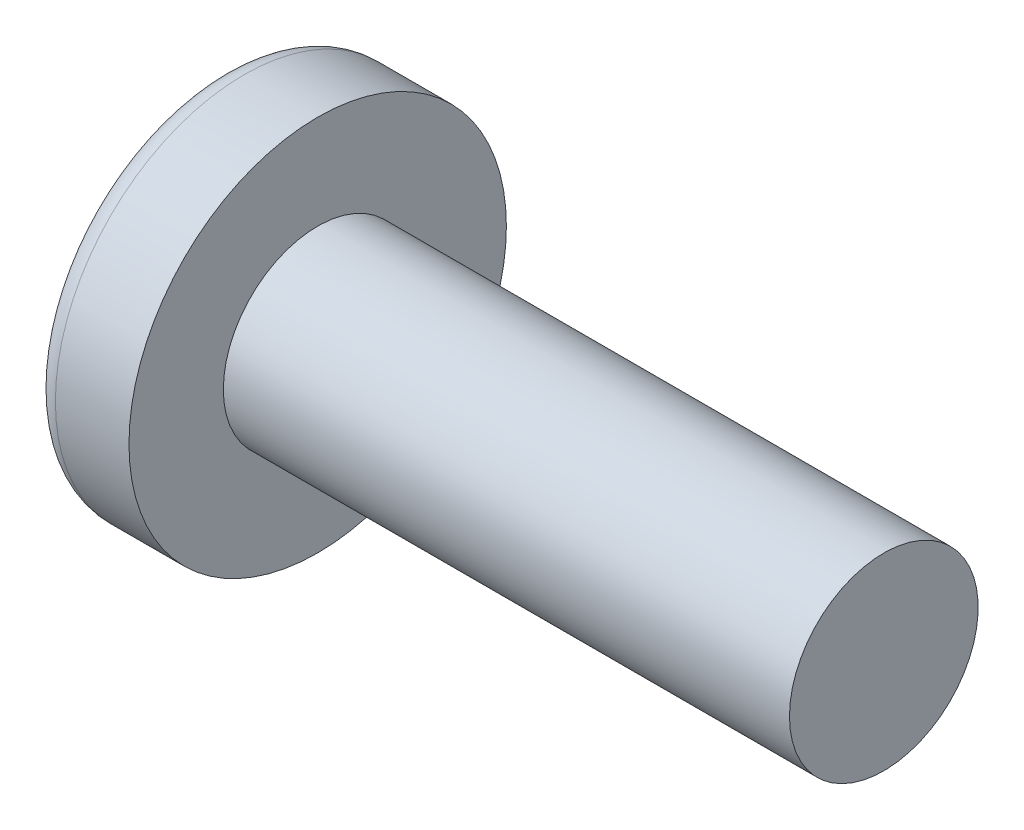
ISO-10303-21;
HEADER;
FILE_DESCRIPTION(('STEP AP214'),'2;1');
FILE_NAME('part.step','',(''),(''),'','','');
FILE_SCHEMA(('AUTOMOTIVE_DESIGN { 1 0 10303 214 1 1 1 1 }'));
ENDSEC;
DATA;
#1=APPLICATION_CONTEXT('core data for automotive mechanical design processes');
#2=APPLICATION_PROTOCOL_DEFINITION('international standard','automotive_design',2000,#1);
#3=PRODUCT_CONTEXT('',#1,'mechanical');
#4=PRODUCT('Part','Part','',(#3));
#5=PRODUCT_RELATED_PRODUCT_CATEGORY('part','',(#4));
#6=PRODUCT_DEFINITION_FORMATION('','',#4);
#7=PRODUCT_DEFINITION_CONTEXT('part definition',#1,'design');
#8=PRODUCT_DEFINITION('design','',#6,#7);
#9=PRODUCT_DEFINITION_SHAPE('','',#8);
#10=(LENGTH_UNIT() NAMED_UNIT(*) SI_UNIT(.MILLI.,.METRE.));
#11=(NAMED_UNIT(*) PLANE_ANGLE_UNIT() SI_UNIT($,.RADIAN.));
#12=(NAMED_UNIT(*) SI_UNIT($,.STERADIAN.) SOLID_ANGLE_UNIT());
#13=UNCERTAINTY_MEASURE_WITH_UNIT(LENGTH_MEASURE(1.E-05),#10,'distance_accuracy_value','');
#14=(GEOMETRIC_REPRESENTATION_CONTEXT(3) GLOBAL_UNCERTAINTY_ASSIGNED_CONTEXT((#13)) GLOBAL_UNIT_ASSIGNED_CONTEXT((#10,
#11,#12)) REPRESENTATION_CONTEXT('',''));
#15=CARTESIAN_POINT('',(0.,0.,0.));
#16=DIRECTION('',(0.,0.,1.));
#17=DIRECTION('',(1.,0.,0.));
#18=AXIS2_PLACEMENT_3D('',#15,#16,#17);
#19=CARTESIAN_POINT('',(3.2,0.,0.));
#20=DIRECTION('',(-1.,0.,0.));
#21=DIRECTION('',(0.,1.,0.));
#22=AXIS2_PLACEMENT_3D('',#19,#20,#21);
#23=SPHERICAL_SURFACE('',#22,3.2);
#24=CARTESIAN_POINT('',(0.627117875780583,0.,0.));
#25=DIRECTION('',(-1.,0.,0.));
#26=DIRECTION('',(0.,0.,1.));
#27=AXIS2_PLACEMENT_3D('',#24,#25,#26);
#28=CIRCLE('',#27,1.9027027027027);
#29=CARTESIAN_POINT('',(0.627117875780583,0.,1.9027027027027));
#30=VERTEX_POINT('',#29);
#31=EDGE_CURVE('E148',#30,#30,#28,.T.);
#32=ORIENTED_EDGE('',*,*,#31,.T.);
#33=EDGE_LOOP('',(#32));
#34=FACE_BOUND('',#33,.T.);
#35=CARTESIAN_POINT('',(3.19174554351625,-0.0818566934638238,0.));
#36=DIRECTION('',(-0.100331502261418,-0.994954064092392,0.));
#37=DIRECTION('',(0.994954064092392,-0.100331502261418,0.));
#38=AXIS2_PLACEMENT_3D('',#35,#36,#37);
#39=CIRCLE('',#38,3.1989422229361);
#40=CARTESIAN_POINT('',(0.118330716626357,0.228067490760365,0.83144431417242));
#41=VERTEX_POINT('',#40);
#42=CARTESIAN_POINT('',(0.0177814447975956,0.238206913129653,0.238206913129654));
#43=VERTEX_POINT('',#42);
#44=EDGE_CURVE('E206',#41,#43,#39,.T.);
#45=ORIENTED_EDGE('',*,*,#44,.F.);
#46=CARTESIAN_POINT('',(2.64043280070581,0.,-0.842892363493775));
#47=DIRECTION('',(0.553083521918191,0.,0.833125811497021));
#48=DIRECTION('',(0.833125811497021,0.,-0.553083521918191));
#49=AXIS2_PLACEMENT_3D('',#46,#47,#48);
#50=CIRCLE('',#49,3.03585523585001);
#51=CARTESIAN_POINT('',(0.118330716626356,-0.22806749076037,0.831444314172418));
#52=VERTEX_POINT('',#51);
#53=EDGE_CURVE('E143',#41,#52,#50,.T.);
#54=ORIENTED_EDGE('',*,*,#53,.T.);
#55=CARTESIAN_POINT('',(3.19174554351625,0.0818566934638236,0.));
#56=DIRECTION('',(-0.100331502261418,0.994954064092392,0.));
#57=DIRECTION('',(-0.994954064092392,-0.100331502261418,0.));
#58=AXIS2_PLACEMENT_3D('',#55,#56,#57);
#59=CIRCLE('',#58,3.1989422229361);
#60=CARTESIAN_POINT('',(0.0177814447975947,-0.238206913129655,0.238206913129654));
#61=VERTEX_POINT('',#60);
#62=EDGE_CURVE('E90',#61,#52,#59,.T.);
#63=ORIENTED_EDGE('',*,*,#62,.F.);
#64=CARTESIAN_POINT('',(3.19174554351625,0.,-0.0818566934638236));
#65=DIRECTION('',(-0.100331502261418,0.,-0.994954064092392));
#66=DIRECTION('',(-0.994954064092392,0.,0.100331502261418));
#67=AXIS2_PLACEMENT_3D('',#64,#65,#66);
#68=CIRCLE('',#67,3.1989422229361);
#69=CARTESIAN_POINT('',(0.118330716626357,-0.831444314172419,0.228067490760367));
#70=VERTEX_POINT('',#69);
#71=EDGE_CURVE('E117',#70,#61,#68,.T.);
#72=ORIENTED_EDGE('',*,*,#71,.F.);
#73=CARTESIAN_POINT('',(2.64043280070581,0.842892363493775,0.));
#74=DIRECTION('',(0.553083521918191,-0.833125811497021,0.));
#75=DIRECTION('',(0.833125811497021,0.553083521918191,0.));
#76=AXIS2_PLACEMENT_3D('',#73,#74,#75);
#77=CIRCLE('',#76,3.03585523585001);
#78=CARTESIAN_POINT('',(0.118330716626356,-0.831444314172419,-0.228067490760367));
#79=VERTEX_POINT('',#78);
#80=EDGE_CURVE('E126',#70,#79,#77,.T.);
#81=ORIENTED_EDGE('',*,*,#80,.T.);
#82=CARTESIAN_POINT('',(3.19174554351625,0.,0.0818566934638238));
#83=DIRECTION('',(-0.100331502261418,0.,0.994954064092392));
#84=DIRECTION('',(0.994954064092392,0.,0.100331502261418));
#85=AXIS2_PLACEMENT_3D('',#82,#83,#84);
#86=CIRCLE('',#85,3.1989422229361);
#87=CARTESIAN_POINT('',(0.0177814447975952,-0.238206913129653,-0.238206913129654));
#88=VERTEX_POINT('',#87);
#89=EDGE_CURVE('E33',#88,#79,#86,.T.);
#90=ORIENTED_EDGE('',*,*,#89,.F.);
#91=CARTESIAN_POINT('',(0.118330716626357,-0.228067490760364,-0.83144431417242));
#92=VERTEX_POINT('',#91);
#93=EDGE_CURVE('E213',#92,#88,#59,.T.);
#94=ORIENTED_EDGE('',*,*,#93,.F.);
#95=CARTESIAN_POINT('',(2.64043280070581,0.,0.842892363493775));
#96=DIRECTION('',(0.553083521918191,0.,-0.833125811497021));
#97=DIRECTION('',(-0.833125811497021,0.,-0.553083521918191));
#98=AXIS2_PLACEMENT_3D('',#95,#96,#97);
#99=CIRCLE('',#98,3.03585523585001);
#100=CARTESIAN_POINT('',(0.118330716626357,0.22806749076037,-0.831444314172418));
#101=VERTEX_POINT('',#100);
#102=EDGE_CURVE('E119',#92,#101,#99,.T.);
#103=ORIENTED_EDGE('',*,*,#102,.T.);
#104=CARTESIAN_POINT('',(0.0177814447975947,0.238206913129655,-0.238206913129654));
#105=VERTEX_POINT('',#104);
#106=EDGE_CURVE('E202',#105,#101,#39,.T.);
#107=ORIENTED_EDGE('',*,*,#106,.F.);
#108=CARTESIAN_POINT('',(0.118330716626357,0.831444314172419,-0.228067490760367));
#109=VERTEX_POINT('',#108);
#110=EDGE_CURVE('E26',#109,#105,#86,.T.);
#111=ORIENTED_EDGE('',*,*,#110,.F.);
#112=CARTESIAN_POINT('',(2.64043280070581,-0.842892363493775,0.));
#113=DIRECTION('',(0.553083521918191,0.833125811497021,0.));
#114=DIRECTION('',(-0.833125811497021,0.553083521918191,0.));
#115=AXIS2_PLACEMENT_3D('',#112,#113,#114);
#116=CIRCLE('',#115,3.03585523585001);
#117=CARTESIAN_POINT('',(0.118330716626357,0.831444314172419,0.228067490760367));
#118=VERTEX_POINT('',#117);
#119=EDGE_CURVE('E11',#109,#118,#116,.T.);
#120=ORIENTED_EDGE('',*,*,#119,.T.);
#121=EDGE_CURVE('E167',#43,#118,#68,.T.);
#122=ORIENTED_EDGE('',*,*,#121,.F.);
#123=EDGE_LOOP('',(#45,#54,#63,#72,#81,#90,#94,#103,#107,#111,#120,#122));
#124=FACE_BOUND('',#123,.T.);
#125=ADVANCED_FACE('F17',(#34,#124),#23,.T.);
#126=CARTESIAN_POINT('',(1.37075949367089,0.,-0.101772151898734));
#127=DIRECTION('',(-0.100331502261418,0.,0.994954064092392));
#128=DIRECTION('',(0.994954064092392,0.,0.100331502261418));
#129=AXIS2_PLACEMENT_3D('',#126,#127,#128);
#130=PLANE('',#129);
#131=ORIENTED_EDGE('',*,*,#110,.T.);
#132=DIRECTION('',(0.989983749746913,-0.0998302940921261,0.0998302940921257));
#133=VECTOR('',#132,1.);
#134=CARTESIAN_POINT('',(1.38081767298512,0.100757881715786,-0.100757881715786));
#135=LINE('',#134,#133);
#136=CARTESIAN_POINT('',(1.19,0.12,-0.12));
#137=VERTEX_POINT('',#136);
#138=EDGE_CURVE('E203',#105,#137,#135,.T.);
#139=ORIENTED_EDGE('',*,*,#138,.T.);
#140=DIRECTION('',(0.830201128729582,-0.551141925795269,0.083717760880294));
#141=VECTOR('',#140,1.);
#142=CARTESIAN_POINT('',(0.,0.91,-0.24));
#143=LINE('',#142,#141);
#144=EDGE_CURVE('E149',#109,#137,#143,.T.);
#145=ORIENTED_EDGE('',*,*,#144,.F.);
#146=EDGE_LOOP('',(#131,#139,#145));
#147=FACE_BOUND('',#146,.T.);
#148=ADVANCED_FACE('F263',(#147),#130,.T.);
#149=DIRECTION('',(0.830201128729582,0.551141925795269,0.083717760880294));
#150=VECTOR('',#149,1.);
#151=CARTESIAN_POINT('',(0.,-0.91,-0.24));
#152=LINE('',#151,#150);
#153=CARTESIAN_POINT('',(1.19,-0.12,-0.12));
#154=VERTEX_POINT('',#153);
#155=EDGE_CURVE('E128',#79,#154,#152,.T.);
#156=ORIENTED_EDGE('',*,*,#155,.T.);
#157=DIRECTION('',(-0.989983749746913,-0.0998302940921252,-0.0998302940921257));
#158=VECTOR('',#157,1.);
#159=CARTESIAN_POINT('',(1.38081767298512,-0.100757881715786,-0.100757881715786));
#160=LINE('',#159,#158);
#161=EDGE_CURVE('E214',#154,#88,#160,.T.);
#162=ORIENTED_EDGE('',*,*,#161,.T.);
#163=ORIENTED_EDGE('',*,*,#89,.T.);
#164=EDGE_LOOP('',(#156,#162,#163));
#165=FACE_BOUND('',#164,.T.);
#166=ADVANCED_FACE('F260',(#165),#130,.T.);
#167=CARTESIAN_POINT('',(1.37075949367089,0.,0.101772151898734));
#168=DIRECTION('',(-0.100331502261418,0.,-0.994954064092392));
#169=DIRECTION('',(-0.994954064092392,0.,0.100331502261418));
#170=AXIS2_PLACEMENT_3D('',#167,#168,#169);
#171=PLANE('',#170);
#172=DIRECTION('',(0.830201128729582,-0.551141925795269,-0.083717760880294));
#173=VECTOR('',#172,1.);
#174=CARTESIAN_POINT('',(0.,0.91,0.24));
#175=LINE('',#174,#173);
#176=CARTESIAN_POINT('',(1.19,0.12,0.12));
#177=VERTEX_POINT('',#176);
#178=EDGE_CURVE('E191',#118,#177,#175,.T.);
#179=ORIENTED_EDGE('',*,*,#178,.T.);
#180=DIRECTION('',(-0.989983749746913,0.0998302940921254,0.0998302940921256));
#181=VECTOR('',#180,1.);
#182=CARTESIAN_POINT('',(1.38081767298512,0.100757881715786,0.100757881715786));
#183=LINE('',#182,#181);
#184=EDGE_CURVE('E209',#177,#43,#183,.T.);
#185=ORIENTED_EDGE('',*,*,#184,.T.);
#186=ORIENTED_EDGE('',*,*,#121,.T.);
#187=EDGE_LOOP('',(#179,#185,#186));
#188=FACE_BOUND('',#187,.T.);
#189=ADVANCED_FACE('F262',(#188),#171,.T.);
#190=ORIENTED_EDGE('',*,*,#71,.T.);
#191=DIRECTION('',(0.989983749746913,0.099830294092126,-0.0998302940921256));
#192=VECTOR('',#191,1.);
#193=CARTESIAN_POINT('',(1.38081767298512,-0.100757881715786,0.100757881715786));
#194=LINE('',#193,#192);
#195=CARTESIAN_POINT('',(1.19,-0.12,0.12));
#196=VERTEX_POINT('',#195);
#197=EDGE_CURVE('E88',#61,#196,#194,.T.);
#198=ORIENTED_EDGE('',*,*,#197,.T.);
#199=DIRECTION('',(0.830201128729582,0.551141925795269,-0.0837177608802938));
#200=VECTOR('',#199,1.);
#201=CARTESIAN_POINT('',(0.,-0.91,0.24));
#202=LINE('',#201,#200);
#203=EDGE_CURVE('E115',#70,#196,#202,.T.);
#204=ORIENTED_EDGE('',*,*,#203,.F.);
#205=EDGE_LOOP('',(#190,#198,#204));
#206=FACE_BOUND('',#205,.T.);
#207=ADVANCED_FACE('F114',(#206),#171,.T.);
#208=CARTESIAN_POINT('',(-25.4,0.,0.));
#209=DIRECTION('',(-1.,0.,0.));
#210=DIRECTION('',(0.,0.,1.));
#211=AXIS2_PLACEMENT_3D('',#208,#209,#210);
#212=CYLINDRICAL_SURFACE('',#211,1.);
#213=CARTESIAN_POINT('',(7.6,0.,0.));
#214=DIRECTION('',(-1.,0.,0.));
#215=DIRECTION('',(0.,0.,1.));
#216=AXIS2_PLACEMENT_3D('',#213,#214,#215);
#217=CIRCLE('',#216,1.);
#218=CARTESIAN_POINT('',(7.6,0.,1.));
#219=VERTEX_POINT('',#218);
#220=EDGE_CURVE('E144',#219,#219,#217,.T.);
#221=ORIENTED_EDGE('',*,*,#220,.T.);
#222=EDGE_LOOP('',(#221));
#223=FACE_BOUND('',#222,.T.);
#224=CARTESIAN_POINT('',(1.6,0.,0.));
#225=DIRECTION('',(-1.,0.,0.));
#226=DIRECTION('',(0.,0.,1.));
#227=AXIS2_PLACEMENT_3D('',#224,#225,#226);
#228=CIRCLE('',#227,1.);
#229=CARTESIAN_POINT('',(1.6,0.,1.));
#230=VERTEX_POINT('',#229);
#231=EDGE_CURVE('E161',#230,#230,#228,.T.);
#232=ORIENTED_EDGE('',*,*,#231,.F.);
#233=EDGE_LOOP('',(#232));
#234=FACE_BOUND('',#233,.T.);
#235=ADVANCED_FACE('F19',(#223,#234),#212,.T.);
#236=CARTESIAN_POINT('',(1.6,1.,0.));
#237=DIRECTION('',(-1.,0.,0.));
#238=DIRECTION('',(0.,0.,1.));
#239=AXIS2_PLACEMENT_3D('',#236,#237,#238);
#240=PLANE('',#239);
#241=CARTESIAN_POINT('',(1.6,0.,0.));
#242=DIRECTION('',(-1.,0.,0.));
#243=DIRECTION('',(0.,0.,1.));
#244=AXIS2_PLACEMENT_3D('',#241,#242,#243);
#245=CIRCLE('',#244,2.);
#246=CARTESIAN_POINT('',(1.6,0.,2.));
#247=VERTEX_POINT('',#246);
#248=EDGE_CURVE('E157',#247,#247,#245,.T.);
#249=ORIENTED_EDGE('',*,*,#248,.F.);
#250=EDGE_LOOP('',(#249));
#251=FACE_BOUND('',#250,.T.);
#252=ORIENTED_EDGE('',*,*,#231,.T.);
#253=EDGE_LOOP('',(#252));
#254=FACE_BOUND('',#253,.T.);
#255=ADVANCED_FACE('F287',(#251,#254),#240,.F.);
#256=CARTESIAN_POINT('',(-25.4,0.,0.));
#257=DIRECTION('',(-1.,0.,0.));
#258=DIRECTION('',(0.,0.,1.));
#259=AXIS2_PLACEMENT_3D('',#256,#257,#258);
#260=CYLINDRICAL_SURFACE('',#259,2.);
#261=ORIENTED_EDGE('',*,*,#248,.T.);
#262=EDGE_LOOP('',(#261));
#263=FACE_BOUND('',#262,.T.);
#264=CARTESIAN_POINT('',(0.820084035097039,0.,0.));
#265=DIRECTION('',(-1.,0.,0.));
#266=DIRECTION('',(0.,0.,1.));
#267=AXIS2_PLACEMENT_3D('',#264,#265,#266);
#268=CIRCLE('',#267,2.);
#269=CARTESIAN_POINT('',(0.820084035097039,0.,2.));
#270=VERTEX_POINT('',#269);
#271=EDGE_CURVE('E153',#270,#270,#268,.T.);
#272=ORIENTED_EDGE('',*,*,#271,.F.);
#273=EDGE_LOOP('',(#272));
#274=FACE_BOUND('',#273,.T.);
#275=ADVANCED_FACE('F284',(#263,#274),#260,.T.);
#276=CARTESIAN_POINT('',(0.820084035097038,0.,0.));
#277=DIRECTION('',(-1.,0.,0.));
#278=DIRECTION('',(0.,0.,1.));
#279=AXIS2_PLACEMENT_3D('',#276,#277,#278);
#280=TOROIDAL_SURFACE('',#279,1.76,0.24);
#281=ORIENTED_EDGE('',*,*,#271,.T.);
#282=EDGE_LOOP('',(#281));
#283=FACE_BOUND('',#282,.T.);
#284=ORIENTED_EDGE('',*,*,#31,.F.);
#285=EDGE_LOOP('',(#284));
#286=FACE_BOUND('',#285,.T.);
#287=ADVANCED_FACE('F281',(#283,#286),#280,.T.);
#288=CARTESIAN_POINT('',(7.6,1.,0.));
#289=DIRECTION('',(1.,0.,0.));
#290=DIRECTION('',(0.,0.,-1.));
#291=AXIS2_PLACEMENT_3D('',#288,#289,#290);
#292=PLANE('',#291);
#293=ORIENTED_EDGE('',*,*,#220,.F.);
#294=EDGE_LOOP('',(#293));
#295=FACE_BOUND('',#294,.T.);
#296=ADVANCED_FACE('F279',(#295),#292,.T.);
#297=CARTESIAN_POINT('',(1.19,0.12,0.12));
#298=DIRECTION('',(0.553083521918191,0.833125811497021,0.));
#299=DIRECTION('',(-0.833125811497021,0.553083521918191,0.));
#300=AXIS2_PLACEMENT_3D('',#297,#298,#299);
#301=PLANE('',#300);
#302=ORIENTED_EDGE('',*,*,#144,.T.);
#303=DIRECTION('',(0.,0.,-1.));
#304=VECTOR('',#303,1.);
#305=CARTESIAN_POINT('',(1.19,0.12,0.12));
#306=LINE('',#305,#304);
#307=EDGE_CURVE('E108',#177,#137,#306,.T.);
#308=ORIENTED_EDGE('',*,*,#307,.F.);
#309=ORIENTED_EDGE('',*,*,#178,.F.);
#310=ORIENTED_EDGE('',*,*,#119,.F.);
#311=EDGE_LOOP('',(#302,#308,#309,#310));
#312=FACE_BOUND('',#311,.T.);
#313=ADVANCED_FACE('F309',(#312),#301,.F.);
#314=CARTESIAN_POINT('',(0.,-0.91,-0.24));
#315=DIRECTION('',(0.553083521918191,-0.833125811497021,0.));
#316=DIRECTION('',(0.833125811497021,0.553083521918191,0.));
#317=AXIS2_PLACEMENT_3D('',#314,#315,#316);
#318=PLANE('',#317);
#319=ORIENTED_EDGE('',*,*,#203,.T.);
#320=DIRECTION('',(0.,0.,1.));
#321=VECTOR('',#320,1.);
#322=CARTESIAN_POINT('',(1.19,-0.12,-0.12));
#323=LINE('',#322,#321);
#324=EDGE_CURVE('E107',#154,#196,#323,.T.);
#325=ORIENTED_EDGE('',*,*,#324,.F.);
#326=ORIENTED_EDGE('',*,*,#155,.F.);
#327=ORIENTED_EDGE('',*,*,#80,.F.);
#328=EDGE_LOOP('',(#319,#325,#326,#327));
#329=FACE_BOUND('',#328,.T.);
#330=ADVANCED_FACE('F123',(#329),#318,.F.);
#331=CARTESIAN_POINT('',(1.19,0.12,-0.12));
#332=DIRECTION('',(-1.,0.,0.));
#333=DIRECTION('',(0.,0.,1.));
#334=AXIS2_PLACEMENT_3D('',#331,#332,#333);
#335=PLANE('',#334);
#336=DIRECTION('',(0.,1.,0.));
#337=VECTOR('',#336,1.);
#338=CARTESIAN_POINT('',(1.19,-0.12,-0.12));
#339=LINE('',#338,#337);
#340=EDGE_CURVE('E132',#154,#137,#339,.T.);
#341=ORIENTED_EDGE('',*,*,#340,.F.);
#342=ORIENTED_EDGE('',*,*,#324,.T.);
#343=DIRECTION('',(0.,-1.,0.));
#344=VECTOR('',#343,1.);
#345=CARTESIAN_POINT('',(1.19,0.12,0.12));
#346=LINE('',#345,#344);
#347=EDGE_CURVE('E98',#177,#196,#346,.T.);
#348=ORIENTED_EDGE('',*,*,#347,.F.);
#349=ORIENTED_EDGE('',*,*,#307,.T.);
#350=EDGE_LOOP('',(#341,#342,#348,#349));
#351=FACE_BOUND('',#350,.T.);
#352=ADVANCED_FACE('F130',(#351),#335,.T.);
#353=CARTESIAN_POINT('',(0.,0.240000000000003,-0.909999999999999));
#354=DIRECTION('',(0.553083521918191,0.,-0.833125811497021));
#355=DIRECTION('',(0.833125811497021,0.,0.553083521918191));
#356=AXIS2_PLACEMENT_3D('',#353,#354,#355);
#357=PLANE('',#356);
#358=DIRECTION('',(0.830201128729582,0.0837177608802919,0.551141925795269));
#359=VECTOR('',#358,1.);
#360=CARTESIAN_POINT('',(0.,-0.239999999999997,-0.910000000000001));
#361=LINE('',#360,#359);
#362=EDGE_CURVE('E222',#92,#154,#361,.T.);
#363=ORIENTED_EDGE('',*,*,#362,.T.);
#364=ORIENTED_EDGE('',*,*,#340,.T.);
#365=DIRECTION('',(0.830201128729582,-0.0837177608802959,0.551141925795269));
#366=VECTOR('',#365,1.);
#367=CARTESIAN_POINT('',(0.,0.240000000000003,-0.909999999999999));
#368=LINE('',#367,#366);
#369=EDGE_CURVE('E95',#101,#137,#368,.T.);
#370=ORIENTED_EDGE('',*,*,#369,.F.);
#371=ORIENTED_EDGE('',*,*,#102,.F.);
#372=EDGE_LOOP('',(#363,#364,#370,#371));
#373=FACE_BOUND('',#372,.T.);
#374=ADVANCED_FACE('F253',(#373),#357,.F.);
#375=CARTESIAN_POINT('',(1.37075949367089,-0.101772151898734,0.));
#376=DIRECTION('',(-0.100331502261418,0.994954064092392,0.));
#377=DIRECTION('',(-0.994954064092392,-0.100331502261418,0.));
#378=AXIS2_PLACEMENT_3D('',#375,#376,#377);
#379=PLANE('',#378);
#380=ORIENTED_EDGE('',*,*,#93,.T.);
#381=ORIENTED_EDGE('',*,*,#161,.F.);
#382=ORIENTED_EDGE('',*,*,#362,.F.);
#383=EDGE_LOOP('',(#380,#381,#382));
#384=FACE_BOUND('',#383,.T.);
#385=ADVANCED_FACE('F259',(#384),#379,.T.);
#386=CARTESIAN_POINT('',(1.37075949367089,0.101772151898734,0.));
#387=DIRECTION('',(-0.100331502261418,-0.994954064092392,0.));
#388=DIRECTION('',(0.994954064092392,-0.100331502261418,0.));
#389=AXIS2_PLACEMENT_3D('',#386,#387,#388);
#390=PLANE('',#389);
#391=ORIENTED_EDGE('',*,*,#106,.T.);
#392=ORIENTED_EDGE('',*,*,#369,.T.);
#393=ORIENTED_EDGE('',*,*,#138,.F.);
#394=EDGE_LOOP('',(#391,#392,#393));
#395=FACE_BOUND('',#394,.T.);
#396=ADVANCED_FACE('F250',(#395),#390,.T.);
#397=CARTESIAN_POINT('',(1.19,-0.12,0.12));
#398=DIRECTION('',(0.553083521918191,0.,0.833125811497021));
#399=DIRECTION('',(-0.833125811497021,0.,0.553083521918191));
#400=AXIS2_PLACEMENT_3D('',#397,#398,#399);
#401=PLANE('',#400);
#402=DIRECTION('',(0.830201128729582,-0.0837177608802921,-0.551141925795269));
#403=VECTOR('',#402,1.);
#404=CARTESIAN_POINT('',(0.,0.239999999999997,0.910000000000001));
#405=LINE('',#404,#403);
#406=EDGE_CURVE('E94',#41,#177,#405,.T.);
#407=ORIENTED_EDGE('',*,*,#406,.T.);
#408=ORIENTED_EDGE('',*,*,#347,.T.);
#409=DIRECTION('',(0.830201128729582,0.0837177608802959,-0.551141925795269));
#410=VECTOR('',#409,1.);
#411=CARTESIAN_POINT('',(0.,-0.240000000000003,0.909999999999999));
#412=LINE('',#411,#410);
#413=EDGE_CURVE('E84',#52,#196,#412,.T.);
#414=ORIENTED_EDGE('',*,*,#413,.F.);
#415=ORIENTED_EDGE('',*,*,#53,.F.);
#416=EDGE_LOOP('',(#407,#408,#414,#415));
#417=FACE_BOUND('',#416,.T.);
#418=ADVANCED_FACE('F99',(#417),#401,.F.);
#419=ORIENTED_EDGE('',*,*,#44,.T.);
#420=ORIENTED_EDGE('',*,*,#184,.F.);
#421=ORIENTED_EDGE('',*,*,#406,.F.);
#422=EDGE_LOOP('',(#419,#420,#421));
#423=FACE_BOUND('',#422,.T.);
#424=ADVANCED_FACE('F324',(#423),#390,.T.);
#425=ORIENTED_EDGE('',*,*,#62,.T.);
#426=ORIENTED_EDGE('',*,*,#413,.T.);
#427=ORIENTED_EDGE('',*,*,#197,.F.);
#428=EDGE_LOOP('',(#425,#426,#427));
#429=FACE_BOUND('',#428,.T.);
#430=ADVANCED_FACE('F86',(#429),#379,.T.);
#431=CLOSED_SHELL('',(#125,#148,#166,#189,#207,#235,#255,#275,#287,#296,#313,#330,#352,#374,
#385,#396,#418,#424,#430));
#432=MANIFOLD_SOLID_BREP('B1',#431);
#433=ADVANCED_BREP_SHAPE_REPRESENTATION('',(#18,#432),#14);
#434=SHAPE_DEFINITION_REPRESENTATION(#9,#433);
ENDSEC;
END-ISO-10303-21;
